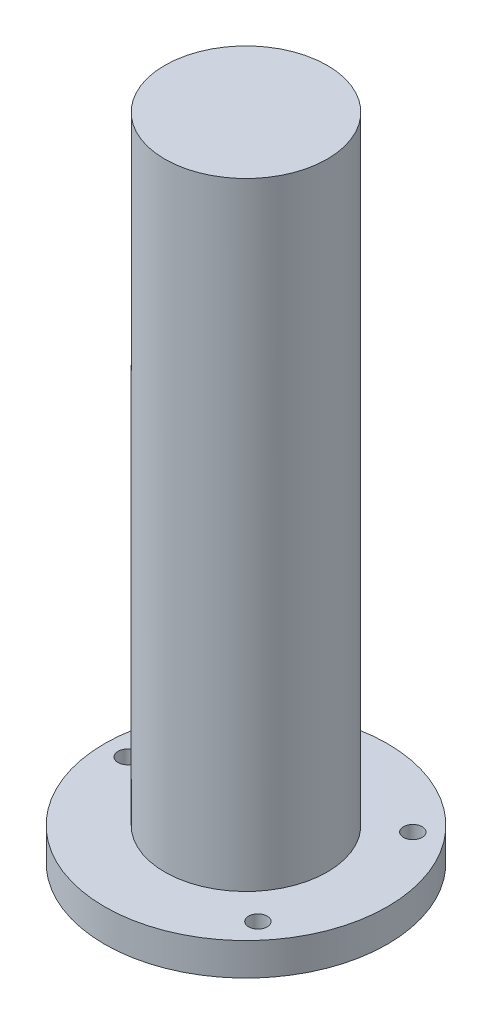
ISO-10303-21;
HEADER;
FILE_DESCRIPTION(('STEP AP214'),'2;1');
FILE_NAME('part.step','',(''),(''),'','','');
FILE_SCHEMA(('AUTOMOTIVE_DESIGN { 1 0 10303 214 1 1 1 1 }'));
ENDSEC;
DATA;
#1=APPLICATION_CONTEXT('core data for automotive mechanical design processes');
#2=APPLICATION_PROTOCOL_DEFINITION('international standard','automotive_design',2000,#1);
#3=PRODUCT_CONTEXT('',#1,'mechanical');
#4=PRODUCT('Part','Part','',(#3));
#5=PRODUCT_RELATED_PRODUCT_CATEGORY('part','',(#4));
#6=PRODUCT_DEFINITION_FORMATION('','',#4);
#7=PRODUCT_DEFINITION_CONTEXT('part definition',#1,'design');
#8=PRODUCT_DEFINITION('design','',#6,#7);
#9=PRODUCT_DEFINITION_SHAPE('','',#8);
#10=(LENGTH_UNIT() NAMED_UNIT(*) SI_UNIT(.MILLI.,.METRE.));
#11=(NAMED_UNIT(*) PLANE_ANGLE_UNIT() SI_UNIT($,.RADIAN.));
#12=(NAMED_UNIT(*) SI_UNIT($,.STERADIAN.) SOLID_ANGLE_UNIT());
#13=UNCERTAINTY_MEASURE_WITH_UNIT(LENGTH_MEASURE(1.E-05),#10,'distance_accuracy_value','');
#14=(GEOMETRIC_REPRESENTATION_CONTEXT(3) GLOBAL_UNCERTAINTY_ASSIGNED_CONTEXT((#13)) GLOBAL_UNIT_ASSIGNED_CONTEXT((#10,
#11,#12)) REPRESENTATION_CONTEXT('',''));
#15=CARTESIAN_POINT('',(0.,0.,0.));
#16=DIRECTION('',(0.,0.,1.));
#17=DIRECTION('',(1.,0.,0.));
#18=AXIS2_PLACEMENT_3D('',#15,#16,#17);
#19=CARTESIAN_POINT('',(0.,101.6,0.));
#20=DIRECTION('',(0.,-1.,0.));
#21=DIRECTION('',(0.,0.,-1.));
#22=AXIS2_PLACEMENT_3D('',#19,#20,#21);
#23=CYLINDRICAL_SURFACE('',#22,12.7);
#24=CARTESIAN_POINT('',(0.,101.6,0.));
#25=DIRECTION('',(0.,-1.,0.));
#26=DIRECTION('',(0.,0.,-1.));
#27=AXIS2_PLACEMENT_3D('',#24,#25,#26);
#28=CIRCLE('',#27,12.7);
#29=CARTESIAN_POINT('',(0.,101.6,-12.7));
#30=VERTEX_POINT('',#29);
#31=EDGE_CURVE('E125',#30,#30,#28,.T.);
#32=ORIENTED_EDGE('',*,*,#31,.T.);
#33=EDGE_LOOP('',(#32));
#34=FACE_BOUND('',#33,.T.);
#35=CARTESIAN_POINT('',(0.,5.08,0.));
#36=DIRECTION('',(0.,1.,0.));
#37=DIRECTION('',(0.,0.,1.));
#38=AXIS2_PLACEMENT_3D('',#35,#36,#37);
#39=CIRCLE('',#38,12.7);
#40=CARTESIAN_POINT('',(-10.16,5.08,7.62));
#41=VERTEX_POINT('',#40);
#42=CARTESIAN_POINT('',(-10.16,5.08,-7.62));
#43=VERTEX_POINT('',#42);
#44=EDGE_CURVE('E132',#41,#43,#39,.T.);
#45=ORIENTED_EDGE('',*,*,#44,.T.);
#46=DIRECTION('',(0.,-1.,0.));
#47=VECTOR('',#46,1.);
#48=CARTESIAN_POINT('',(-10.16,101.6,-7.62));
#49=LINE('',#48,#47);
#50=CARTESIAN_POINT('',(-10.16,16.1769685742605,-7.62));
#51=VERTEX_POINT('',#50);
#52=EDGE_CURVE('E115',#43,#51,#49,.F.);
#53=ORIENTED_EDGE('',*,*,#52,.T.);
#54=CARTESIAN_POINT('',(0.,16.1769685742605,0.));
#55=DIRECTION('',(0.,-1.,0.));
#56=DIRECTION('',(0.,0.,-1.));
#57=AXIS2_PLACEMENT_3D('',#54,#55,#56);
#58=CIRCLE('',#57,12.7);
#59=CARTESIAN_POINT('',(-10.16,16.1769685742605,7.62));
#60=VERTEX_POINT('',#59);
#61=EDGE_CURVE('E86',#51,#60,#58,.F.);
#62=ORIENTED_EDGE('',*,*,#61,.T.);
#63=DIRECTION('',(0.,-1.,0.));
#64=VECTOR('',#63,1.);
#65=CARTESIAN_POINT('',(-10.16,101.6,7.62));
#66=LINE('',#65,#64);
#67=EDGE_CURVE('E90',#41,#60,#66,.F.);
#68=ORIENTED_EDGE('',*,*,#67,.F.);
#69=EDGE_LOOP('',(#45,#53,#62,#68));
#70=FACE_BOUND('',#69,.T.);
#71=ADVANCED_FACE('F41',(#34,#70),#23,.T.);
#72=CARTESIAN_POINT('',(0.,17.78,0.));
#73=DIRECTION('',(0.,-1.,0.));
#74=DIRECTION('',(0.,0.,-1.));
#75=AXIS2_PLACEMENT_3D('',#72,#73,#74);
#76=CYLINDRICAL_SURFACE('',#75,7.62);
#77=CARTESIAN_POINT('',(0.,0.,0.));
#78=DIRECTION('',(0.,-1.,0.));
#79=DIRECTION('',(0.,0.,-1.));
#80=AXIS2_PLACEMENT_3D('',#77,#78,#79);
#81=CIRCLE('',#80,7.62);
#82=CARTESIAN_POINT('',(0.,0.,-7.62));
#83=VERTEX_POINT('',#82);
#84=EDGE_CURVE('E120',#83,#83,#81,.T.);
#85=ORIENTED_EDGE('',*,*,#84,.T.);
#86=EDGE_LOOP('',(#85));
#87=FACE_BOUND('',#86,.T.);
#88=CARTESIAN_POINT('',(0.,17.78,0.));
#89=DIRECTION('',(0.,-1.,0.));
#90=DIRECTION('',(0.,0.,-1.));
#91=AXIS2_PLACEMENT_3D('',#88,#89,#90);
#92=CIRCLE('',#91,7.62);
#93=CARTESIAN_POINT('',(0.,17.78,-7.62));
#94=VERTEX_POINT('',#93);
#95=EDGE_CURVE('E121',#94,#94,#92,.T.);
#96=ORIENTED_EDGE('',*,*,#95,.F.);
#97=EDGE_LOOP('',(#96));
#98=FACE_BOUND('',#97,.T.);
#99=CARTESIAN_POINT('',(0.,16.1769685742605,0.));
#100=DIRECTION('',(0.,-1.,0.));
#101=DIRECTION('',(0.,0.,-1.));
#102=AXIS2_PLACEMENT_3D('',#99,#100,#101);
#103=CIRCLE('',#102,7.62);
#104=CARTESIAN_POINT('',(0.,16.1769685742605,-7.62));
#105=VERTEX_POINT('',#104);
#106=CARTESIAN_POINT('',(0.,16.1769685742605,7.62));
#107=VERTEX_POINT('',#106);
#108=EDGE_CURVE('E11',#105,#107,#103,.F.);
#109=ORIENTED_EDGE('',*,*,#108,.F.);
#110=DIRECTION('',(0.,-1.,0.));
#111=VECTOR('',#110,1.);
#112=CARTESIAN_POINT('',(0.,16.1769685742605,-7.62));
#113=LINE('',#112,#111);
#114=CARTESIAN_POINT('',(0.,5.08,-7.62));
#115=VERTEX_POINT('',#114);
#116=EDGE_CURVE('E95',#105,#115,#113,.T.);
#117=ORIENTED_EDGE('',*,*,#116,.T.);
#118=CARTESIAN_POINT('',(0.,5.08,0.));
#119=DIRECTION('',(0.,-1.,0.));
#120=DIRECTION('',(0.,0.,-1.));
#121=AXIS2_PLACEMENT_3D('',#118,#119,#120);
#122=CIRCLE('',#121,7.62);
#123=CARTESIAN_POINT('',(0.,5.08,7.62));
#124=VERTEX_POINT('',#123);
#125=EDGE_CURVE('E50',#115,#124,#122,.F.);
#126=ORIENTED_EDGE('',*,*,#125,.T.);
#127=DIRECTION('',(0.,-1.,0.));
#128=VECTOR('',#127,1.);
#129=CARTESIAN_POINT('',(0.,16.1769685742605,7.62));
#130=LINE('',#129,#128);
#131=EDGE_CURVE('E101',#107,#124,#130,.T.);
#132=ORIENTED_EDGE('',*,*,#131,.F.);
#133=EDGE_LOOP('',(#109,#117,#126,#132));
#134=FACE_BOUND('',#133,.T.);
#135=ADVANCED_FACE('F103',(#87,#98,#134),#76,.F.);
#136=CARTESIAN_POINT('',(0.,5.08,0.));
#137=DIRECTION('',(0.,1.,0.));
#138=DIRECTION('',(0.,0.,1.));
#139=AXIS2_PLACEMENT_3D('',#136,#137,#138);
#140=PLANE('',#139);
#141=DIRECTION('',(1.,0.,0.));
#142=VECTOR('',#141,1.);
#143=CARTESIAN_POINT('',(-22.098,5.08,-7.62));
#144=LINE('',#143,#142);
#145=EDGE_CURVE('E91',#43,#115,#144,.T.);
#146=ORIENTED_EDGE('',*,*,#145,.F.);
#147=ORIENTED_EDGE('',*,*,#44,.F.);
#148=DIRECTION('',(1.,0.,0.));
#149=VECTOR('',#148,1.);
#150=CARTESIAN_POINT('',(-22.098,5.08,7.62));
#151=LINE('',#150,#149);
#152=EDGE_CURVE('E57',#41,#124,#151,.T.);
#153=ORIENTED_EDGE('',*,*,#152,.T.);
#154=ORIENTED_EDGE('',*,*,#125,.F.);
#155=EDGE_LOOP('',(#146,#147,#153,#154));
#156=FACE_BOUND('',#155,.T.);
#157=CARTESIAN_POINT('',(0.,5.08,0.));
#158=DIRECTION('',(0.,1.,0.));
#159=DIRECTION('',(0.,0.,1.));
#160=AXIS2_PLACEMENT_3D('',#157,#158,#159);
#161=CIRCLE('',#160,22.098);
#162=CARTESIAN_POINT('',(0.,5.08,22.098));
#163=VERTEX_POINT('',#162);
#164=EDGE_CURVE('E149',#163,#163,#161,.T.);
#165=ORIENTED_EDGE('',*,*,#164,.T.);
#166=EDGE_LOOP('',(#165));
#167=FACE_BOUND('',#166,.T.);
#168=CARTESIAN_POINT('',(-18.48485,5.08,0.));
#169=DIRECTION('',(0.,1.,0.));
#170=DIRECTION('',(0.,0.,1.));
#171=AXIS2_PLACEMENT_3D('',#168,#169,#170);
#172=CIRCLE('',#171,1.524);
#173=CARTESIAN_POINT('',(-18.48485,5.08,1.524));
#174=VERTEX_POINT('',#173);
#175=EDGE_CURVE('E136',#174,#174,#172,.T.);
#176=ORIENTED_EDGE('',*,*,#175,.F.);
#177=EDGE_LOOP('',(#176));
#178=FACE_BOUND('',#177,.T.);
#179=CARTESIAN_POINT('',(13.9683375198822,5.08,12.1068256142208));
#180=DIRECTION('',(0.,-1.,0.));
#181=DIRECTION('',(0.,0.,-1.));
#182=AXIS2_PLACEMENT_3D('',#179,#180,#181);
#183=CIRCLE('',#182,1.4605);
#184=CARTESIAN_POINT('',(13.9683375198822,5.08,13.5673256142208));
#185=VERTEX_POINT('',#184);
#186=EDGE_CURVE('E142',#185,#185,#183,.T.);
#187=ORIENTED_EDGE('',*,*,#186,.T.);
#188=EDGE_LOOP('',(#187));
#189=FACE_BOUND('',#188,.T.);
#190=CARTESIAN_POINT('',(13.9683375198822,5.08,-12.1068256142208));
#191=DIRECTION('',(0.,1.,0.));
#192=DIRECTION('',(0.,0.,1.));
#193=AXIS2_PLACEMENT_3D('',#190,#191,#192);
#194=CIRCLE('',#193,1.4605);
#195=CARTESIAN_POINT('',(13.9683375198822,5.08,-10.6463256142208));
#196=VERTEX_POINT('',#195);
#197=EDGE_CURVE('E137',#196,#196,#194,.T.);
#198=ORIENTED_EDGE('',*,*,#197,.F.);
#199=EDGE_LOOP('',(#198));
#200=FACE_BOUND('',#199,.T.);
#201=ADVANCED_FACE('F195',(#156,#167,#178,#189,#200),#140,.T.);
#202=CARTESIAN_POINT('',(0.,0.,0.));
#203=DIRECTION('',(0.,1.,0.));
#204=DIRECTION('',(0.,0.,1.));
#205=AXIS2_PLACEMENT_3D('',#202,#203,#204);
#206=PLANE('',#205);
#207=ORIENTED_EDGE('',*,*,#84,.F.);
#208=EDGE_LOOP('',(#207));
#209=FACE_BOUND('',#208,.T.);
#210=CARTESIAN_POINT('',(13.9683375198822,0.,-12.1068256142208));
#211=DIRECTION('',(0.,1.,0.));
#212=DIRECTION('',(0.,0.,1.));
#213=AXIS2_PLACEMENT_3D('',#210,#211,#212);
#214=CIRCLE('',#213,1.4605);
#215=CARTESIAN_POINT('',(13.9683375198822,0.,-10.6463256142208));
#216=VERTEX_POINT('',#215);
#217=EDGE_CURVE('E157',#216,#216,#214,.T.);
#218=ORIENTED_EDGE('',*,*,#217,.T.);
#219=EDGE_LOOP('',(#218));
#220=FACE_BOUND('',#219,.T.);
#221=CARTESIAN_POINT('',(-18.48485,0.,0.));
#222=DIRECTION('',(0.,1.,0.));
#223=DIRECTION('',(0.,0.,1.));
#224=AXIS2_PLACEMENT_3D('',#221,#222,#223);
#225=CIRCLE('',#224,1.524);
#226=CARTESIAN_POINT('',(-18.48485,0.,1.524));
#227=VERTEX_POINT('',#226);
#228=EDGE_CURVE('E141',#227,#227,#225,.T.);
#229=ORIENTED_EDGE('',*,*,#228,.T.);
#230=EDGE_LOOP('',(#229));
#231=FACE_BOUND('',#230,.T.);
#232=CARTESIAN_POINT('',(0.,0.,0.));
#233=DIRECTION('',(0.,1.,0.));
#234=DIRECTION('',(0.,0.,1.));
#235=AXIS2_PLACEMENT_3D('',#232,#233,#234);
#236=CIRCLE('',#235,22.098);
#237=CARTESIAN_POINT('',(0.,0.,22.098));
#238=VERTEX_POINT('',#237);
#239=EDGE_CURVE('E153',#238,#238,#236,.T.);
#240=ORIENTED_EDGE('',*,*,#239,.F.);
#241=EDGE_LOOP('',(#240));
#242=FACE_BOUND('',#241,.T.);
#243=CARTESIAN_POINT('',(13.9683375198822,0.,12.1068256142208));
#244=DIRECTION('',(0.,1.,0.));
#245=DIRECTION('',(0.,0.,1.));
#246=AXIS2_PLACEMENT_3D('',#243,#244,#245);
#247=CIRCLE('',#246,1.4605);
#248=CARTESIAN_POINT('',(13.9683375198822,0.,13.5673256142208));
#249=VERTEX_POINT('',#248);
#250=EDGE_CURVE('E161',#249,#249,#247,.F.);
#251=ORIENTED_EDGE('',*,*,#250,.F.);
#252=EDGE_LOOP('',(#251));
#253=FACE_BOUND('',#252,.T.);
#254=ADVANCED_FACE('F170',(#209,#220,#231,#242,#253),#206,.F.);
#255=CARTESIAN_POINT('',(0.,5.08,0.));
#256=DIRECTION('',(0.,-1.,0.));
#257=DIRECTION('',(0.,0.,-1.));
#258=AXIS2_PLACEMENT_3D('',#255,#256,#257);
#259=CYLINDRICAL_SURFACE('',#258,22.098);
#260=ORIENTED_EDGE('',*,*,#164,.F.);
#261=EDGE_LOOP('',(#260));
#262=FACE_BOUND('',#261,.T.);
#263=ORIENTED_EDGE('',*,*,#239,.T.);
#264=EDGE_LOOP('',(#263));
#265=FACE_BOUND('',#264,.T.);
#266=ADVANCED_FACE('F43',(#262,#265),#259,.T.);
#267=CARTESIAN_POINT('',(-18.48485,-53.34,0.));
#268=DIRECTION('',(0.,1.,0.));
#269=DIRECTION('',(0.,0.,1.));
#270=AXIS2_PLACEMENT_3D('',#267,#268,#269);
#271=CYLINDRICAL_SURFACE('',#270,1.524);
#272=CARTESIAN_POINT('',(-18.48485,5.08,1.524));
#273=CARTESIAN_POINT('',(-18.48485,5.02708333333333,1.524));
#274=CARTESIAN_POINT('',(-18.48485,4.97416666666667,1.524));
#275=CARTESIAN_POINT('',(-18.48485,4.86833333333334,1.524));
#276=CARTESIAN_POINT('',(-18.48485,4.81541666666667,1.524));
#277=CARTESIAN_POINT('',(-18.48485,4.70958333333334,1.524));
#278=CARTESIAN_POINT('',(-18.48485,4.65666666666667,1.524));
#279=CARTESIAN_POINT('',(-18.48485,4.55083333333334,1.524));
#280=CARTESIAN_POINT('',(-18.48485,4.49791666666667,1.524));
#281=CARTESIAN_POINT('',(-18.48485,4.39208333333334,1.524));
#282=CARTESIAN_POINT('',(-18.48485,4.33916666666667,1.524));
#283=CARTESIAN_POINT('',(-18.48485,4.23333333333333,1.524));
#284=CARTESIAN_POINT('',(-18.48485,4.18041666666667,1.524));
#285=CARTESIAN_POINT('',(-18.48485,4.07458333333333,1.524));
#286=CARTESIAN_POINT('',(-18.48485,4.02166666666667,1.524));
#287=CARTESIAN_POINT('',(-18.48485,3.91583333333333,1.524));
#288=CARTESIAN_POINT('',(-18.48485,3.86291666666667,1.524));
#289=CARTESIAN_POINT('',(-18.48485,3.75708333333333,1.524));
#290=CARTESIAN_POINT('',(-18.48485,3.70416666666667,1.524));
#291=CARTESIAN_POINT('',(-18.48485,3.59833333333334,1.524));
#292=CARTESIAN_POINT('',(-18.48485,3.54541666666667,1.524));
#293=CARTESIAN_POINT('',(-18.48485,3.43958333333334,1.524));
#294=CARTESIAN_POINT('',(-18.48485,3.38666666666667,1.524));
#295=CARTESIAN_POINT('',(-18.48485,3.28083333333333,1.524));
#296=CARTESIAN_POINT('',(-18.48485,3.22791666666667,1.524));
#297=CARTESIAN_POINT('',(-18.48485,3.12208333333333,1.524));
#298=CARTESIAN_POINT('',(-18.48485,3.06916666666666,1.524));
#299=CARTESIAN_POINT('',(-18.48485,2.96333333333333,1.524));
#300=CARTESIAN_POINT('',(-18.48485,2.91041666666667,1.524));
#301=CARTESIAN_POINT('',(-18.48485,2.80458333333333,1.524));
#302=CARTESIAN_POINT('',(-18.48485,2.75166666666667,1.524));
#303=CARTESIAN_POINT('',(-18.48485,2.64583333333333,1.524));
#304=CARTESIAN_POINT('',(-18.48485,2.59291666666667,1.524));
#305=CARTESIAN_POINT('',(-18.48485,2.48708333333333,1.524));
#306=CARTESIAN_POINT('',(-18.48485,2.43416666666667,1.524));
#307=CARTESIAN_POINT('',(-18.48485,2.32833333333333,1.524));
#308=CARTESIAN_POINT('',(-18.48485,2.27541666666667,1.524));
#309=CARTESIAN_POINT('',(-18.48485,2.16958333333334,1.524));
#310=CARTESIAN_POINT('',(-18.48485,2.11666666666667,1.524));
#311=CARTESIAN_POINT('',(-18.48485,2.01083333333334,1.524));
#312=CARTESIAN_POINT('',(-18.48485,1.95791666666667,1.524));
#313=CARTESIAN_POINT('',(-18.48485,1.85208333333334,1.524));
#314=CARTESIAN_POINT('',(-18.48485,1.79916666666667,1.524));
#315=CARTESIAN_POINT('',(-18.48485,1.69333333333333,1.524));
#316=CARTESIAN_POINT('',(-18.48485,1.64041666666667,1.524));
#317=CARTESIAN_POINT('',(-18.48485,1.53458333333333,1.524));
#318=CARTESIAN_POINT('',(-18.48485,1.48166666666667,1.524));
#319=CARTESIAN_POINT('',(-18.48485,1.37583333333333,1.524));
#320=CARTESIAN_POINT('',(-18.48485,1.32291666666667,1.524));
#321=CARTESIAN_POINT('',(-18.48485,1.21708333333333,1.524));
#322=CARTESIAN_POINT('',(-18.48485,1.16416666666667,1.524));
#323=CARTESIAN_POINT('',(-18.48485,1.05833333333333,1.524));
#324=CARTESIAN_POINT('',(-18.48485,1.00541666666667,1.524));
#325=CARTESIAN_POINT('',(-18.48485,0.899583333333336,1.524));
#326=CARTESIAN_POINT('',(-18.48485,0.846666666666669,1.524));
#327=CARTESIAN_POINT('',(-18.48485,0.740833333333334,1.524));
#328=CARTESIAN_POINT('',(-18.48485,0.687916666666665,1.524));
#329=CARTESIAN_POINT('',(-18.48485,0.58208333333333,1.524));
#330=CARTESIAN_POINT('',(-18.48485,0.529166666666664,1.524));
#331=CARTESIAN_POINT('',(-18.48485,0.423333333333331,1.524));
#332=CARTESIAN_POINT('',(-18.48485,0.370416666666665,1.524));
#333=CARTESIAN_POINT('',(-18.48485,0.264583333333332,1.524));
#334=CARTESIAN_POINT('',(-18.48485,0.211666666666666,1.524));
#335=CARTESIAN_POINT('',(-18.48485,0.105833333333333,1.524));
#336=CARTESIAN_POINT('',(-18.48485,0.0529166666666663,1.524));
#337=CARTESIAN_POINT('',(-18.48485,0.,1.524));
#338=B_SPLINE_CURVE_WITH_KNOTS('',3,(#272,#273,#274,#275,#276,#277,#278,#279,#280,#281,#282,
#283,#284,#285,#286,#287,#288,#289,#290,#291,#292,#293,#294,#295,#296,#297,#298,#299,#300,#301,
#302,#303,#304,#305,#306,#307,#308,#309,#310,#311,#312,#313,#314,#315,#316,#317,#318,#319,#320,
#321,#322,#323,#324,#325,#326,#327,#328,#329,#330,#331,#332,#333,#334,#335,#336,#337),
.UNSPECIFIED.,.F.,.F.,(4,2,2,2,2,2,2,2,2,2,2,2,2,2,2,2,2,2,2,2,2,2,2,2,2,2,2,2,2,2,2,2,4),(0.,
0.158749999999999,0.317499999999998,0.476249999999998,0.634999999999997,0.793750000000003,
0.952500000000002,1.11125,1.27,1.42875,1.5875,1.74625,1.905,2.06375,2.2225,2.38125,2.54,2.69875,
2.8575,3.01625,3.175,3.33375,3.4925,3.65125,3.81,3.96875,4.1275,4.28625,4.445,4.60375,4.7625,
4.92125,5.08),.UNSPECIFIED.);
#339=EDGE_CURVE('BSEAM186',#174,#227,#338,.T.);
#340=ORIENTED_EDGE('',*,*,#175,.T.);
#341=ORIENTED_EDGE('',*,*,#228,.F.);
#342=ORIENTED_EDGE('',*,*,#339,.T.);
#343=ORIENTED_EDGE('',*,*,#339,.F.);
#344=EDGE_LOOP('',(#340,#342,#341,#343));
#345=FACE_BOUND('',#344,.T.);
#346=ADVANCED_FACE('F186',(#345),#271,.F.);
#347=CARTESIAN_POINT('',(13.9683375198822,-53.34,12.1068256142208));
#348=DIRECTION('',(0.,1.,0.));
#349=DIRECTION('',(0.,0.,1.));
#350=AXIS2_PLACEMENT_3D('',#347,#348,#349);
#351=CYLINDRICAL_SURFACE('',#350,1.4605);
#352=CARTESIAN_POINT('',(13.9683375198822,5.08,13.5673256142208));
#353=CARTESIAN_POINT('',(13.9683375198822,5.02708333333333,13.5673256142208));
#354=CARTESIAN_POINT('',(13.9683375198822,4.97416666666667,13.5673256142208));
#355=CARTESIAN_POINT('',(13.9683375198822,4.86833333333334,13.5673256142208));
#356=CARTESIAN_POINT('',(13.9683375198822,4.81541666666667,13.5673256142208));
#357=CARTESIAN_POINT('',(13.9683375198822,4.70958333333334,13.5673256142208));
#358=CARTESIAN_POINT('',(13.9683375198822,4.65666666666667,13.5673256142208));
#359=CARTESIAN_POINT('',(13.9683375198822,4.55083333333334,13.5673256142208));
#360=CARTESIAN_POINT('',(13.9683375198822,4.49791666666667,13.5673256142208));
#361=CARTESIAN_POINT('',(13.9683375198822,4.39208333333334,13.5673256142208));
#362=CARTESIAN_POINT('',(13.9683375198822,4.33916666666667,13.5673256142208));
#363=CARTESIAN_POINT('',(13.9683375198822,4.23333333333333,13.5673256142208));
#364=CARTESIAN_POINT('',(13.9683375198822,4.18041666666667,13.5673256142208));
#365=CARTESIAN_POINT('',(13.9683375198822,4.07458333333333,13.5673256142208));
#366=CARTESIAN_POINT('',(13.9683375198822,4.02166666666667,13.5673256142208));
#367=CARTESIAN_POINT('',(13.9683375198822,3.91583333333333,13.5673256142208));
#368=CARTESIAN_POINT('',(13.9683375198822,3.86291666666667,13.5673256142208));
#369=CARTESIAN_POINT('',(13.9683375198822,3.75708333333333,13.5673256142208));
#370=CARTESIAN_POINT('',(13.9683375198822,3.70416666666667,13.5673256142208));
#371=CARTESIAN_POINT('',(13.9683375198822,3.59833333333334,13.5673256142208));
#372=CARTESIAN_POINT('',(13.9683375198822,3.54541666666667,13.5673256142208));
#373=CARTESIAN_POINT('',(13.9683375198822,3.43958333333334,13.5673256142208));
#374=CARTESIAN_POINT('',(13.9683375198822,3.38666666666667,13.5673256142208));
#375=CARTESIAN_POINT('',(13.9683375198822,3.28083333333333,13.5673256142208));
#376=CARTESIAN_POINT('',(13.9683375198822,3.22791666666667,13.5673256142208));
#377=CARTESIAN_POINT('',(13.9683375198822,3.12208333333333,13.5673256142208));
#378=CARTESIAN_POINT('',(13.9683375198822,3.06916666666666,13.5673256142208));
#379=CARTESIAN_POINT('',(13.9683375198822,2.96333333333333,13.5673256142208));
#380=CARTESIAN_POINT('',(13.9683375198822,2.91041666666667,13.5673256142208));
#381=CARTESIAN_POINT('',(13.9683375198822,2.80458333333333,13.5673256142208));
#382=CARTESIAN_POINT('',(13.9683375198822,2.75166666666667,13.5673256142208));
#383=CARTESIAN_POINT('',(13.9683375198822,2.64583333333333,13.5673256142208));
#384=CARTESIAN_POINT('',(13.9683375198822,2.59291666666667,13.5673256142208));
#385=CARTESIAN_POINT('',(13.9683375198822,2.48708333333333,13.5673256142208));
#386=CARTESIAN_POINT('',(13.9683375198822,2.43416666666667,13.5673256142208));
#387=CARTESIAN_POINT('',(13.9683375198822,2.32833333333333,13.5673256142208));
#388=CARTESIAN_POINT('',(13.9683375198822,2.27541666666667,13.5673256142208));
#389=CARTESIAN_POINT('',(13.9683375198822,2.16958333333334,13.5673256142208));
#390=CARTESIAN_POINT('',(13.9683375198822,2.11666666666667,13.5673256142208));
#391=CARTESIAN_POINT('',(13.9683375198822,2.01083333333334,13.5673256142208));
#392=CARTESIAN_POINT('',(13.9683375198822,1.95791666666667,13.5673256142208));
#393=CARTESIAN_POINT('',(13.9683375198822,1.85208333333334,13.5673256142208));
#394=CARTESIAN_POINT('',(13.9683375198822,1.79916666666667,13.5673256142208));
#395=CARTESIAN_POINT('',(13.9683375198822,1.69333333333333,13.5673256142208));
#396=CARTESIAN_POINT('',(13.9683375198822,1.64041666666667,13.5673256142208));
#397=CARTESIAN_POINT('',(13.9683375198822,1.53458333333333,13.5673256142208));
#398=CARTESIAN_POINT('',(13.9683375198822,1.48166666666667,13.5673256142208));
#399=CARTESIAN_POINT('',(13.9683375198822,1.37583333333333,13.5673256142208));
#400=CARTESIAN_POINT('',(13.9683375198822,1.32291666666667,13.5673256142208));
#401=CARTESIAN_POINT('',(13.9683375198822,1.21708333333333,13.5673256142208));
#402=CARTESIAN_POINT('',(13.9683375198822,1.16416666666667,13.5673256142208));
#403=CARTESIAN_POINT('',(13.9683375198822,1.05833333333333,13.5673256142208));
#404=CARTESIAN_POINT('',(13.9683375198822,1.00541666666667,13.5673256142208));
#405=CARTESIAN_POINT('',(13.9683375198822,0.899583333333336,13.5673256142208));
#406=CARTESIAN_POINT('',(13.9683375198822,0.846666666666669,13.5673256142208));
#407=CARTESIAN_POINT('',(13.9683375198822,0.740833333333334,13.5673256142208));
#408=CARTESIAN_POINT('',(13.9683375198822,0.687916666666665,13.5673256142208));
#409=CARTESIAN_POINT('',(13.9683375198822,0.58208333333333,13.5673256142208));
#410=CARTESIAN_POINT('',(13.9683375198822,0.529166666666664,13.5673256142208));
#411=CARTESIAN_POINT('',(13.9683375198822,0.423333333333331,13.5673256142208));
#412=CARTESIAN_POINT('',(13.9683375198822,0.370416666666665,13.5673256142208));
#413=CARTESIAN_POINT('',(13.9683375198822,0.264583333333332,13.5673256142208));
#414=CARTESIAN_POINT('',(13.9683375198822,0.211666666666666,13.5673256142208));
#415=CARTESIAN_POINT('',(13.9683375198822,0.105833333333333,13.5673256142208));
#416=CARTESIAN_POINT('',(13.9683375198822,0.0529166666666663,13.5673256142208));
#417=CARTESIAN_POINT('',(13.9683375198822,0.,13.5673256142208));
#418=B_SPLINE_CURVE_WITH_KNOTS('',3,(#352,#353,#354,#355,#356,#357,#358,#359,#360,#361,#362,
#363,#364,#365,#366,#367,#368,#369,#370,#371,#372,#373,#374,#375,#376,#377,#378,#379,#380,#381,
#382,#383,#384,#385,#386,#387,#388,#389,#390,#391,#392,#393,#394,#395,#396,#397,#398,#399,#400,
#401,#402,#403,#404,#405,#406,#407,#408,#409,#410,#411,#412,#413,#414,#415,#416,#417),
.UNSPECIFIED.,.F.,.F.,(4,2,2,2,2,2,2,2,2,2,2,2,2,2,2,2,2,2,2,2,2,2,2,2,2,2,2,2,2,2,2,2,4),(0.,
0.158749999999999,0.317499999999998,0.476249999999998,0.634999999999997,0.793750000000003,
0.952500000000002,1.11125,1.27,1.42875,1.5875,1.74625,1.905,2.06375,2.2225,2.38125,2.54,2.69875,
2.8575,3.01625,3.175,3.33375,3.4925,3.65125,3.81,3.96875,4.1275,4.28625,4.445,4.60375,4.7625,
4.92125,5.08),.UNSPECIFIED.);
#419=EDGE_CURVE('BSEAM176',#185,#249,#418,.T.);
#420=ORIENTED_EDGE('',*,*,#186,.F.);
#421=ORIENTED_EDGE('',*,*,#250,.T.);
#422=ORIENTED_EDGE('',*,*,#419,.T.);
#423=ORIENTED_EDGE('',*,*,#419,.F.);
#424=EDGE_LOOP('',(#420,#422,#421,#423));
#425=FACE_BOUND('',#424,.T.);
#426=ADVANCED_FACE('F176',(#425),#351,.F.);
#427=CARTESIAN_POINT('',(13.9683375198822,-53.34,-12.1068256142208));
#428=DIRECTION('',(0.,1.,0.));
#429=DIRECTION('',(0.,0.,1.));
#430=AXIS2_PLACEMENT_3D('',#427,#428,#429);
#431=CYLINDRICAL_SURFACE('',#430,1.4605);
#432=CARTESIAN_POINT('',(13.9683375198822,5.08,-10.6463256142208));
#433=CARTESIAN_POINT('',(13.9683375198822,5.02708333333333,-10.6463256142208));
#434=CARTESIAN_POINT('',(13.9683375198822,4.97416666666667,-10.6463256142208));
#435=CARTESIAN_POINT('',(13.9683375198822,4.86833333333334,-10.6463256142208));
#436=CARTESIAN_POINT('',(13.9683375198822,4.81541666666667,-10.6463256142208));
#437=CARTESIAN_POINT('',(13.9683375198822,4.70958333333334,-10.6463256142208));
#438=CARTESIAN_POINT('',(13.9683375198822,4.65666666666667,-10.6463256142208));
#439=CARTESIAN_POINT('',(13.9683375198822,4.55083333333334,-10.6463256142208));
#440=CARTESIAN_POINT('',(13.9683375198822,4.49791666666667,-10.6463256142208));
#441=CARTESIAN_POINT('',(13.9683375198822,4.39208333333334,-10.6463256142208));
#442=CARTESIAN_POINT('',(13.9683375198822,4.33916666666667,-10.6463256142208));
#443=CARTESIAN_POINT('',(13.9683375198822,4.23333333333333,-10.6463256142208));
#444=CARTESIAN_POINT('',(13.9683375198822,4.18041666666667,-10.6463256142208));
#445=CARTESIAN_POINT('',(13.9683375198822,4.07458333333333,-10.6463256142208));
#446=CARTESIAN_POINT('',(13.9683375198822,4.02166666666667,-10.6463256142208));
#447=CARTESIAN_POINT('',(13.9683375198822,3.91583333333333,-10.6463256142208));
#448=CARTESIAN_POINT('',(13.9683375198822,3.86291666666667,-10.6463256142208));
#449=CARTESIAN_POINT('',(13.9683375198822,3.75708333333333,-10.6463256142208));
#450=CARTESIAN_POINT('',(13.9683375198822,3.70416666666667,-10.6463256142208));
#451=CARTESIAN_POINT('',(13.9683375198822,3.59833333333334,-10.6463256142208));
#452=CARTESIAN_POINT('',(13.9683375198822,3.54541666666667,-10.6463256142208));
#453=CARTESIAN_POINT('',(13.9683375198822,3.43958333333334,-10.6463256142208));
#454=CARTESIAN_POINT('',(13.9683375198822,3.38666666666667,-10.6463256142208));
#455=CARTESIAN_POINT('',(13.9683375198822,3.28083333333333,-10.6463256142208));
#456=CARTESIAN_POINT('',(13.9683375198822,3.22791666666667,-10.6463256142208));
#457=CARTESIAN_POINT('',(13.9683375198822,3.12208333333333,-10.6463256142208));
#458=CARTESIAN_POINT('',(13.9683375198822,3.06916666666666,-10.6463256142208));
#459=CARTESIAN_POINT('',(13.9683375198822,2.96333333333333,-10.6463256142208));
#460=CARTESIAN_POINT('',(13.9683375198822,2.91041666666667,-10.6463256142208));
#461=CARTESIAN_POINT('',(13.9683375198822,2.80458333333333,-10.6463256142208));
#462=CARTESIAN_POINT('',(13.9683375198822,2.75166666666667,-10.6463256142208));
#463=CARTESIAN_POINT('',(13.9683375198822,2.64583333333333,-10.6463256142208));
#464=CARTESIAN_POINT('',(13.9683375198822,2.59291666666667,-10.6463256142208));
#465=CARTESIAN_POINT('',(13.9683375198822,2.48708333333333,-10.6463256142208));
#466=CARTESIAN_POINT('',(13.9683375198822,2.43416666666667,-10.6463256142208));
#467=CARTESIAN_POINT('',(13.9683375198822,2.32833333333333,-10.6463256142208));
#468=CARTESIAN_POINT('',(13.9683375198822,2.27541666666667,-10.6463256142208));
#469=CARTESIAN_POINT('',(13.9683375198822,2.16958333333334,-10.6463256142208));
#470=CARTESIAN_POINT('',(13.9683375198822,2.11666666666667,-10.6463256142208));
#471=CARTESIAN_POINT('',(13.9683375198822,2.01083333333334,-10.6463256142208));
#472=CARTESIAN_POINT('',(13.9683375198822,1.95791666666667,-10.6463256142208));
#473=CARTESIAN_POINT('',(13.9683375198822,1.85208333333334,-10.6463256142208));
#474=CARTESIAN_POINT('',(13.9683375198822,1.79916666666667,-10.6463256142208));
#475=CARTESIAN_POINT('',(13.9683375198822,1.69333333333333,-10.6463256142208));
#476=CARTESIAN_POINT('',(13.9683375198822,1.64041666666667,-10.6463256142208));
#477=CARTESIAN_POINT('',(13.9683375198822,1.53458333333333,-10.6463256142208));
#478=CARTESIAN_POINT('',(13.9683375198822,1.48166666666667,-10.6463256142208));
#479=CARTESIAN_POINT('',(13.9683375198822,1.37583333333333,-10.6463256142208));
#480=CARTESIAN_POINT('',(13.9683375198822,1.32291666666667,-10.6463256142208));
#481=CARTESIAN_POINT('',(13.9683375198822,1.21708333333333,-10.6463256142208));
#482=CARTESIAN_POINT('',(13.9683375198822,1.16416666666667,-10.6463256142208));
#483=CARTESIAN_POINT('',(13.9683375198822,1.05833333333333,-10.6463256142208));
#484=CARTESIAN_POINT('',(13.9683375198822,1.00541666666667,-10.6463256142208));
#485=CARTESIAN_POINT('',(13.9683375198822,0.899583333333336,-10.6463256142208));
#486=CARTESIAN_POINT('',(13.9683375198822,0.846666666666669,-10.6463256142208));
#487=CARTESIAN_POINT('',(13.9683375198822,0.740833333333334,-10.6463256142208));
#488=CARTESIAN_POINT('',(13.9683375198822,0.687916666666665,-10.6463256142208));
#489=CARTESIAN_POINT('',(13.9683375198822,0.58208333333333,-10.6463256142208));
#490=CARTESIAN_POINT('',(13.9683375198822,0.529166666666664,-10.6463256142208));
#491=CARTESIAN_POINT('',(13.9683375198822,0.423333333333331,-10.6463256142208));
#492=CARTESIAN_POINT('',(13.9683375198822,0.370416666666665,-10.6463256142208));
#493=CARTESIAN_POINT('',(13.9683375198822,0.264583333333332,-10.6463256142208));
#494=CARTESIAN_POINT('',(13.9683375198822,0.211666666666666,-10.6463256142208));
#495=CARTESIAN_POINT('',(13.9683375198822,0.105833333333333,-10.6463256142208));
#496=CARTESIAN_POINT('',(13.9683375198822,0.0529166666666663,-10.6463256142208));
#497=CARTESIAN_POINT('',(13.9683375198822,0.,-10.6463256142208));
#498=B_SPLINE_CURVE_WITH_KNOTS('',3,(#432,#433,#434,#435,#436,#437,#438,#439,#440,#441,#442,
#443,#444,#445,#446,#447,#448,#449,#450,#451,#452,#453,#454,#455,#456,#457,#458,#459,#460,#461,
#462,#463,#464,#465,#466,#467,#468,#469,#470,#471,#472,#473,#474,#475,#476,#477,#478,#479,#480,
#481,#482,#483,#484,#485,#486,#487,#488,#489,#490,#491,#492,#493,#494,#495,#496,#497),
.UNSPECIFIED.,.F.,.F.,(4,2,2,2,2,2,2,2,2,2,2,2,2,2,2,2,2,2,2,2,2,2,2,2,2,2,2,2,2,2,2,2,4),(0.,
0.158749999999999,0.317499999999998,0.476249999999998,0.634999999999997,0.793750000000003,
0.952500000000002,1.11125,1.27,1.42875,1.5875,1.74625,1.905,2.06375,2.2225,2.38125,2.54,2.69875,
2.8575,3.01625,3.175,3.33375,3.4925,3.65125,3.81,3.96875,4.1275,4.28625,4.445,4.60375,4.7625,
4.92125,5.08),.UNSPECIFIED.);
#499=EDGE_CURVE('BSEAM173',#196,#216,#498,.T.);
#500=ORIENTED_EDGE('',*,*,#197,.T.);
#501=ORIENTED_EDGE('',*,*,#217,.F.);
#502=ORIENTED_EDGE('',*,*,#499,.T.);
#503=ORIENTED_EDGE('',*,*,#499,.F.);
#504=EDGE_LOOP('',(#500,#502,#501,#503));
#505=FACE_BOUND('',#504,.T.);
#506=ADVANCED_FACE('F173',(#505),#431,.F.);
#507=CARTESIAN_POINT('',(0.,101.6,0.));
#508=DIRECTION('',(0.,-1.,0.));
#509=DIRECTION('',(0.,0.,-1.));
#510=AXIS2_PLACEMENT_3D('',#507,#508,#509);
#511=PLANE('',#510);
#512=ORIENTED_EDGE('',*,*,#31,.F.);
#513=EDGE_LOOP('',(#512));
#514=FACE_BOUND('',#513,.T.);
#515=ADVANCED_FACE('F175',(#514),#511,.F.);
#516=CARTESIAN_POINT('',(0.,17.78,0.));
#517=DIRECTION('',(0.,-1.,0.));
#518=DIRECTION('',(0.,0.,-1.));
#519=AXIS2_PLACEMENT_3D('',#516,#517,#518);
#520=PLANE('',#519);
#521=ORIENTED_EDGE('',*,*,#95,.T.);
#522=EDGE_LOOP('',(#521));
#523=FACE_BOUND('',#522,.T.);
#524=ADVANCED_FACE('F183',(#523),#520,.T.);
#525=CARTESIAN_POINT('',(-22.098,16.1769685742605,7.62));
#526=DIRECTION('',(0.,-1.,0.));
#527=DIRECTION('',(0.,0.,-1.));
#528=AXIS2_PLACEMENT_3D('',#525,#526,#527);
#529=PLANE('',#528);
#530=DIRECTION('',(1.,0.,0.));
#531=VECTOR('',#530,1.);
#532=CARTESIAN_POINT('',(-22.098,16.1769685742605,-7.62));
#533=LINE('',#532,#531);
#534=EDGE_CURVE('E80',#51,#105,#533,.T.);
#535=ORIENTED_EDGE('',*,*,#534,.T.);
#536=ORIENTED_EDGE('',*,*,#108,.T.);
#537=DIRECTION('',(1.,0.,0.));
#538=VECTOR('',#537,1.);
#539=CARTESIAN_POINT('',(-22.098,16.1769685742605,7.62));
#540=LINE('',#539,#538);
#541=EDGE_CURVE('E62',#60,#107,#540,.T.);
#542=ORIENTED_EDGE('',*,*,#541,.F.);
#543=ORIENTED_EDGE('',*,*,#61,.F.);
#544=EDGE_LOOP('',(#535,#536,#542,#543));
#545=FACE_BOUND('',#544,.T.);
#546=ADVANCED_FACE('F82',(#545),#529,.T.);
#547=CARTESIAN_POINT('',(-22.098,16.1769685742605,-7.62));
#548=DIRECTION('',(0.,0.,1.));
#549=DIRECTION('',(1.,0.,0.));
#550=AXIS2_PLACEMENT_3D('',#547,#548,#549);
#551=PLANE('',#550);
#552=ORIENTED_EDGE('',*,*,#145,.T.);
#553=ORIENTED_EDGE('',*,*,#116,.F.);
#554=ORIENTED_EDGE('',*,*,#534,.F.);
#555=ORIENTED_EDGE('',*,*,#52,.F.);
#556=EDGE_LOOP('',(#552,#553,#554,#555));
#557=FACE_BOUND('',#556,.T.);
#558=ADVANCED_FACE('F96',(#557),#551,.T.);
#559=CARTESIAN_POINT('',(-22.098,16.1769685742605,7.62));
#560=DIRECTION('',(0.,0.,1.));
#561=DIRECTION('',(1.,0.,0.));
#562=AXIS2_PLACEMENT_3D('',#559,#560,#561);
#563=PLANE('',#562);
#564=ORIENTED_EDGE('',*,*,#67,.T.);
#565=ORIENTED_EDGE('',*,*,#541,.T.);
#566=ORIENTED_EDGE('',*,*,#131,.T.);
#567=ORIENTED_EDGE('',*,*,#152,.F.);
#568=EDGE_LOOP('',(#564,#565,#566,#567));
#569=FACE_BOUND('',#568,.T.);
#570=ADVANCED_FACE('F207',(#569),#563,.F.);
#571=CLOSED_SHELL('',(#71,#135,#201,#254,#266,#346,#426,#506,#515,#524,#546,#558,#570));
#572=MANIFOLD_SOLID_BREP('B2',#571);
#573=ADVANCED_BREP_SHAPE_REPRESENTATION('',(#18,#572),#14);
#574=SHAPE_DEFINITION_REPRESENTATION(#9,#573);
ENDSEC;
END-ISO-10303-21;
